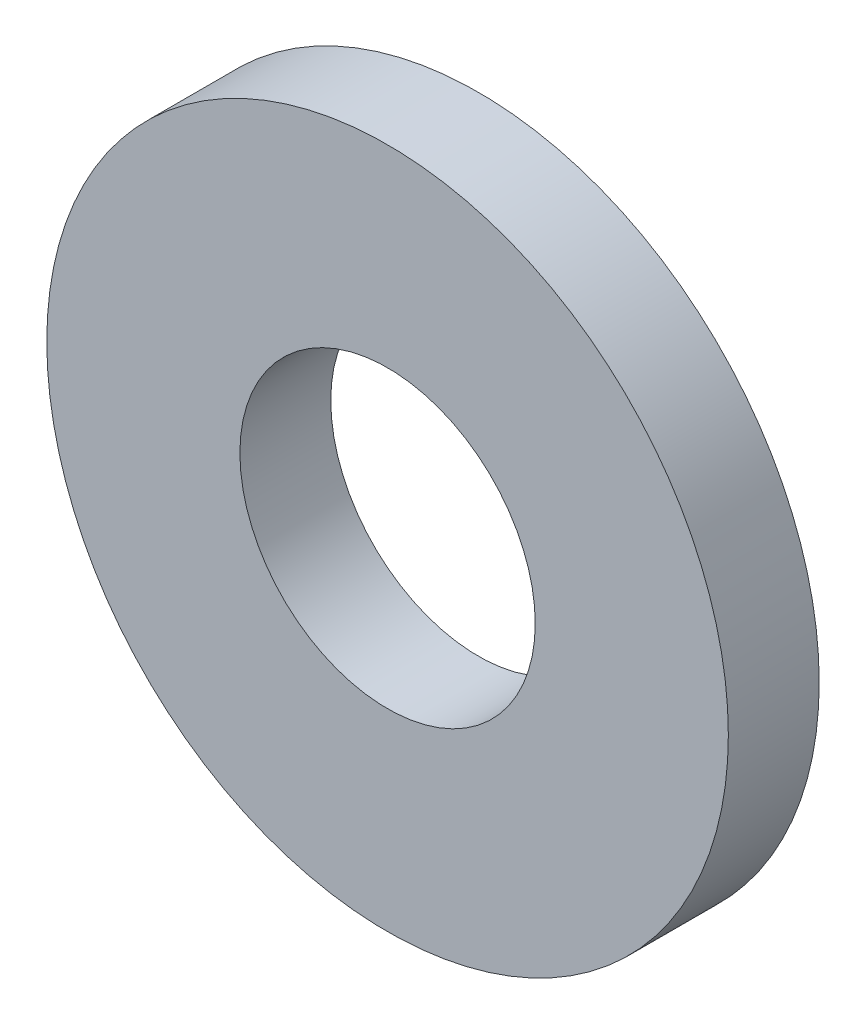
ISO-10303-21;
HEADER;
FILE_DESCRIPTION(('STEP AP214'),'2;1');
FILE_NAME('part.step','',(''),(''),'','','');
FILE_SCHEMA(('AUTOMOTIVE_DESIGN { 1 0 10303 214 1 1 1 1 }'));
ENDSEC;
DATA;
#1=APPLICATION_CONTEXT('core data for automotive mechanical design processes');
#2=APPLICATION_PROTOCOL_DEFINITION('international standard','automotive_design',2000,#1);
#3=PRODUCT_CONTEXT('',#1,'mechanical');
#4=PRODUCT('Part','Part','',(#3));
#5=PRODUCT_RELATED_PRODUCT_CATEGORY('part','',(#4));
#6=PRODUCT_DEFINITION_FORMATION('','',#4);
#7=PRODUCT_DEFINITION_CONTEXT('part definition',#1,'design');
#8=PRODUCT_DEFINITION('design','',#6,#7);
#9=PRODUCT_DEFINITION_SHAPE('','',#8);
#10=(LENGTH_UNIT() NAMED_UNIT(*) SI_UNIT(.MILLI.,.METRE.));
#11=(NAMED_UNIT(*) PLANE_ANGLE_UNIT() SI_UNIT($,.RADIAN.));
#12=(NAMED_UNIT(*) SI_UNIT($,.STERADIAN.) SOLID_ANGLE_UNIT());
#13=UNCERTAINTY_MEASURE_WITH_UNIT(LENGTH_MEASURE(1.E-05),#10,'distance_accuracy_value','');
#14=(GEOMETRIC_REPRESENTATION_CONTEXT(3) GLOBAL_UNCERTAINTY_ASSIGNED_CONTEXT((#13)) GLOBAL_UNIT_ASSIGNED_CONTEXT((#10,
#11,#12)) REPRESENTATION_CONTEXT('',''));
#15=CARTESIAN_POINT('',(0.,0.,0.));
#16=DIRECTION('',(0.,0.,1.));
#17=DIRECTION('',(1.,0.,0.));
#18=AXIS2_PLACEMENT_3D('',#15,#16,#17);
#19=CARTESIAN_POINT('',(0.,0.,2.));
#20=DIRECTION('',(0.,0.,1.));
#21=DIRECTION('',(1.,0.,0.));
#22=AXIS2_PLACEMENT_3D('',#19,#20,#21);
#23=PLANE('',#22);
#24=CARTESIAN_POINT('',(0.,0.,2.));
#25=DIRECTION('',(0.,0.,1.));
#26=DIRECTION('',(1.,0.,0.));
#27=AXIS2_PLACEMENT_3D('',#24,#25,#26);
#28=CIRCLE('',#27,7.5);
#29=CARTESIAN_POINT('',(7.5,0.,2.));
#30=VERTEX_POINT('',#29);
#31=EDGE_CURVE('E10',#30,#30,#28,.T.);
#32=ORIENTED_EDGE('',*,*,#31,.T.);
#33=EDGE_LOOP('',(#32));
#34=FACE_BOUND('',#33,.T.);
#35=CARTESIAN_POINT('',(0.,0.,2.));
#36=DIRECTION('',(0.,0.,1.));
#37=DIRECTION('',(1.,0.,0.));
#38=AXIS2_PLACEMENT_3D('',#35,#36,#37);
#39=CIRCLE('',#38,3.25);
#40=CARTESIAN_POINT('',(3.25,0.,2.));
#41=VERTEX_POINT('',#40);
#42=EDGE_CURVE('E41',#41,#41,#39,.T.);
#43=ORIENTED_EDGE('',*,*,#42,.F.);
#44=EDGE_LOOP('',(#43));
#45=FACE_BOUND('',#44,.T.);
#46=ADVANCED_FACE('F30',(#34,#45),#23,.T.);
#47=CARTESIAN_POINT('',(0.,0.,0.));
#48=DIRECTION('',(0.,0.,1.));
#49=DIRECTION('',(1.,0.,0.));
#50=AXIS2_PLACEMENT_3D('',#47,#48,#49);
#51=PLANE('',#50);
#52=CARTESIAN_POINT('',(0.,0.,0.));
#53=DIRECTION('',(0.,0.,1.));
#54=DIRECTION('',(1.,0.,0.));
#55=AXIS2_PLACEMENT_3D('',#52,#53,#54);
#56=CIRCLE('',#55,7.5);
#57=CARTESIAN_POINT('',(7.5,0.,0.));
#58=VERTEX_POINT('',#57);
#59=EDGE_CURVE('E34',#58,#58,#56,.T.);
#60=ORIENTED_EDGE('',*,*,#59,.F.);
#61=EDGE_LOOP('',(#60));
#62=FACE_BOUND('',#61,.T.);
#63=CARTESIAN_POINT('',(0.,0.,0.));
#64=DIRECTION('',(0.,0.,1.));
#65=DIRECTION('',(1.,0.,0.));
#66=AXIS2_PLACEMENT_3D('',#63,#64,#65);
#67=CIRCLE('',#66,3.25);
#68=CARTESIAN_POINT('',(3.25,0.,0.));
#69=VERTEX_POINT('',#68);
#70=EDGE_CURVE('E43',#69,#69,#67,.T.);
#71=ORIENTED_EDGE('',*,*,#70,.T.);
#72=EDGE_LOOP('',(#71));
#73=FACE_BOUND('',#72,.T.);
#74=ADVANCED_FACE('F53',(#62,#73),#51,.F.);
#75=CARTESIAN_POINT('',(0.,0.,2.));
#76=DIRECTION('',(0.,0.,-1.));
#77=DIRECTION('',(-1.,0.,0.));
#78=AXIS2_PLACEMENT_3D('',#75,#76,#77);
#79=CYLINDRICAL_SURFACE('',#78,7.5);
#80=ORIENTED_EDGE('',*,*,#31,.F.);
#81=EDGE_LOOP('',(#80));
#82=FACE_BOUND('',#81,.T.);
#83=ORIENTED_EDGE('',*,*,#59,.T.);
#84=EDGE_LOOP('',(#83));
#85=FACE_BOUND('',#84,.T.);
#86=ADVANCED_FACE('F32',(#82,#85),#79,.T.);
#87=CARTESIAN_POINT('',(0.,0.,2.));
#88=DIRECTION('',(0.,0.,-1.));
#89=DIRECTION('',(-1.,0.,0.));
#90=AXIS2_PLACEMENT_3D('',#87,#88,#89);
#91=CYLINDRICAL_SURFACE('',#90,3.25);
#92=ORIENTED_EDGE('',*,*,#42,.T.);
#93=EDGE_LOOP('',(#92));
#94=FACE_BOUND('',#93,.T.);
#95=ORIENTED_EDGE('',*,*,#70,.F.);
#96=EDGE_LOOP('',(#95));
#97=FACE_BOUND('',#96,.T.);
#98=ADVANCED_FACE('F49',(#94,#97),#91,.F.);
#99=CLOSED_SHELL('',(#46,#74,#86,#98));
#100=MANIFOLD_SOLID_BREP('B2',#99);
#101=ADVANCED_BREP_SHAPE_REPRESENTATION('',(#18,#100),#14);
#102=SHAPE_DEFINITION_REPRESENTATION(#9,#101);
ENDSEC;
END-ISO-10303-21;
